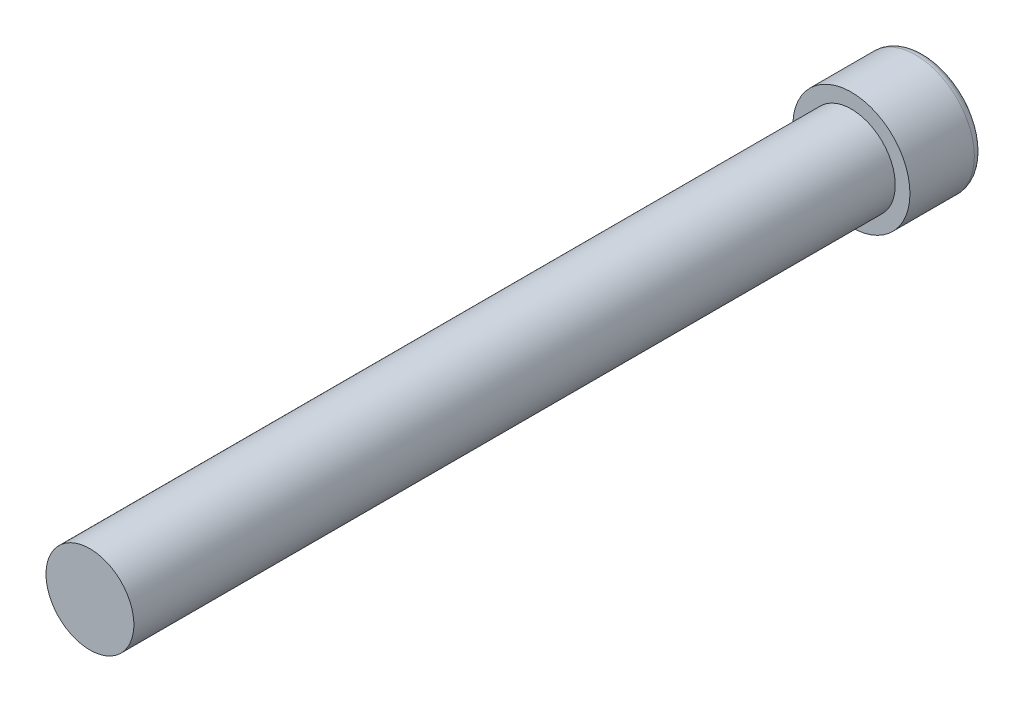
ISO-10303-21;
HEADER;
FILE_DESCRIPTION(('STEP AP214'),'2;1');
FILE_NAME('part.step','',(''),(''),'','','');
FILE_SCHEMA(('AUTOMOTIVE_DESIGN { 1 0 10303 214 1 1 1 1 }'));
ENDSEC;
DATA;
#1=APPLICATION_CONTEXT('core data for automotive mechanical design processes');
#2=APPLICATION_PROTOCOL_DEFINITION('international standard','automotive_design',2000,#1);
#3=PRODUCT_CONTEXT('',#1,'mechanical');
#4=PRODUCT('Part','Part','',(#3));
#5=PRODUCT_RELATED_PRODUCT_CATEGORY('part','',(#4));
#6=PRODUCT_DEFINITION_FORMATION('','',#4);
#7=PRODUCT_DEFINITION_CONTEXT('part definition',#1,'design');
#8=PRODUCT_DEFINITION('design','',#6,#7);
#9=PRODUCT_DEFINITION_SHAPE('','',#8);
#10=(LENGTH_UNIT() NAMED_UNIT(*) SI_UNIT(.MILLI.,.METRE.));
#11=(NAMED_UNIT(*) PLANE_ANGLE_UNIT() SI_UNIT($,.RADIAN.));
#12=(NAMED_UNIT(*) SI_UNIT($,.STERADIAN.) SOLID_ANGLE_UNIT());
#13=UNCERTAINTY_MEASURE_WITH_UNIT(LENGTH_MEASURE(1.E-05),#10,'distance_accuracy_value','');
#14=(GEOMETRIC_REPRESENTATION_CONTEXT(3) GLOBAL_UNCERTAINTY_ASSIGNED_CONTEXT((#13)) GLOBAL_UNIT_ASSIGNED_CONTEXT((#10,
#11,#12)) REPRESENTATION_CONTEXT('',''));
#15=CARTESIAN_POINT('',(0.,0.,0.));
#16=DIRECTION('',(0.,0.,1.));
#17=DIRECTION('',(1.,0.,0.));
#18=AXIS2_PLACEMENT_3D('',#15,#16,#17);
#19=CARTESIAN_POINT('',(0.,0.,2.5));
#20=DIRECTION('',(0.,0.,1.));
#21=DIRECTION('',(1.,0.,0.));
#22=AXIS2_PLACEMENT_3D('',#19,#20,#21);
#23=PLANE('',#22);
#24=CARTESIAN_POINT('',(0.,0.,2.5));
#25=DIRECTION('',(0.,0.,1.));
#26=DIRECTION('',(1.,0.,0.));
#27=AXIS2_PLACEMENT_3D('',#24,#25,#26);
#28=CIRCLE('',#27,2.);
#29=CARTESIAN_POINT('',(2.,0.,2.5));
#30=VERTEX_POINT('',#29);
#31=EDGE_CURVE('E141',#30,#30,#28,.T.);
#32=ORIENTED_EDGE('',*,*,#31,.T.);
#33=EDGE_LOOP('',(#32));
#34=FACE_BOUND('',#33,.T.);
#35=CARTESIAN_POINT('',(0.,0.,2.5));
#36=DIRECTION('',(0.,0.,1.));
#37=DIRECTION('',(1.,0.,0.));
#38=AXIS2_PLACEMENT_3D('',#35,#36,#37);
#39=CIRCLE('',#38,1.5);
#40=CARTESIAN_POINT('',(-1.5,0.,2.5));
#41=VERTEX_POINT('',#40);
#42=EDGE_CURVE('E132',#41,#41,#39,.T.);
#43=ORIENTED_EDGE('',*,*,#42,.F.);
#44=EDGE_LOOP('',(#43));
#45=FACE_BOUND('',#44,.T.);
#46=ADVANCED_FACE('F30',(#34,#45),#23,.T.);
#47=CARTESIAN_POINT('',(0.,0.,2.5));
#48=DIRECTION('',(0.,0.,-1.));
#49=DIRECTION('',(-1.,0.,0.));
#50=AXIS2_PLACEMENT_3D('',#47,#48,#49);
#51=CYLINDRICAL_SURFACE('',#50,2.);
#52=CARTESIAN_POINT('',(0.,0.,0.3));
#53=DIRECTION('',(0.,0.,1.));
#54=DIRECTION('',(1.,0.,0.));
#55=AXIS2_PLACEMENT_3D('',#52,#53,#54);
#56=CIRCLE('',#55,2.);
#57=CARTESIAN_POINT('',(2.,0.,0.3));
#58=VERTEX_POINT('',#57);
#59=EDGE_CURVE('E38',#58,#58,#56,.T.);
#60=ORIENTED_EDGE('',*,*,#59,.T.);
#61=EDGE_LOOP('',(#60));
#62=FACE_BOUND('',#61,.T.);
#63=ORIENTED_EDGE('',*,*,#31,.F.);
#64=EDGE_LOOP('',(#63));
#65=FACE_BOUND('',#64,.T.);
#66=ADVANCED_FACE('F148',(#62,#65),#51,.T.);
#67=CARTESIAN_POINT('',(0.,0.,0.));
#68=DIRECTION('',(0.,0.,1.));
#69=DIRECTION('',(1.,0.,0.));
#70=AXIS2_PLACEMENT_3D('',#67,#68,#69);
#71=PLANE('',#70);
#72=DIRECTION('',(0.5,0.866025403784439,0.));
#73=VECTOR('',#72,1.);
#74=CARTESIAN_POINT('',(-1.5357517160444,0.,0.));
#75=LINE('',#74,#73);
#76=CARTESIAN_POINT('',(-1.5357517160444,0.,0.));
#77=VERTEX_POINT('',#76);
#78=CARTESIAN_POINT('',(-0.767875858022201,1.33,0.));
#79=VERTEX_POINT('',#78);
#80=EDGE_CURVE('E119',#77,#79,#75,.T.);
#81=ORIENTED_EDGE('',*,*,#80,.F.);
#82=DIRECTION('',(-0.5,0.866025403784439,0.));
#83=VECTOR('',#82,1.);
#84=CARTESIAN_POINT('',(-0.767875858022202,-1.33,0.));
#85=LINE('',#84,#83);
#86=CARTESIAN_POINT('',(-0.767875858022202,-1.33,0.));
#87=VERTEX_POINT('',#86);
#88=EDGE_CURVE('E45',#87,#77,#85,.T.);
#89=ORIENTED_EDGE('',*,*,#88,.F.);
#90=DIRECTION('',(-1.,0.,0.));
#91=VECTOR('',#90,1.);
#92=CARTESIAN_POINT('',(0.767875858022202,-1.33,0.));
#93=LINE('',#92,#91);
#94=CARTESIAN_POINT('',(0.767875858022202,-1.33,0.));
#95=VERTEX_POINT('',#94);
#96=EDGE_CURVE('E128',#95,#87,#93,.T.);
#97=ORIENTED_EDGE('',*,*,#96,.F.);
#98=DIRECTION('',(-0.5,-0.866025403784438,0.));
#99=VECTOR('',#98,1.);
#100=CARTESIAN_POINT('',(1.5357517160444,0.,0.));
#101=LINE('',#100,#99);
#102=CARTESIAN_POINT('',(1.5357517160444,0.,0.));
#103=VERTEX_POINT('',#102);
#104=EDGE_CURVE('E126',#103,#95,#101,.T.);
#105=ORIENTED_EDGE('',*,*,#104,.F.);
#106=DIRECTION('',(0.5,-0.866025403784439,0.));
#107=VECTOR('',#106,1.);
#108=CARTESIAN_POINT('',(0.767875858022202,1.33,0.));
#109=LINE('',#108,#107);
#110=CARTESIAN_POINT('',(0.767875858022202,1.33,0.));
#111=VERTEX_POINT('',#110);
#112=EDGE_CURVE('E93',#111,#103,#109,.T.);
#113=ORIENTED_EDGE('',*,*,#112,.F.);
#114=DIRECTION('',(1.,0.,0.));
#115=VECTOR('',#114,1.);
#116=CARTESIAN_POINT('',(-0.767875858022201,1.33,0.));
#117=LINE('',#116,#115);
#118=EDGE_CURVE('E122',#79,#111,#117,.T.);
#119=ORIENTED_EDGE('',*,*,#118,.F.);
#120=EDGE_LOOP('',(#81,#89,#97,#105,#113,#119));
#121=FACE_BOUND('',#120,.T.);
#122=CARTESIAN_POINT('',(0.,0.,0.));
#123=DIRECTION('',(0.,0.,1.));
#124=DIRECTION('',(1.,0.,0.));
#125=AXIS2_PLACEMENT_3D('',#122,#123,#124);
#126=CIRCLE('',#125,1.7);
#127=CARTESIAN_POINT('',(1.7,0.,0.));
#128=VERTEX_POINT('',#127);
#129=EDGE_CURVE('E11',#128,#128,#126,.F.);
#130=ORIENTED_EDGE('',*,*,#129,.T.);
#131=EDGE_LOOP('',(#130));
#132=FACE_BOUND('',#131,.T.);
#133=ADVANCED_FACE('F171',(#121,#132),#71,.F.);
#134=CARTESIAN_POINT('',(0.,0.,28.5));
#135=DIRECTION('',(0.,0.,-1.));
#136=DIRECTION('',(-1.,0.,0.));
#137=AXIS2_PLACEMENT_3D('',#134,#135,#136);
#138=CYLINDRICAL_SURFACE('',#137,1.5);
#139=CARTESIAN_POINT('',(0.,0.,28.5));
#140=DIRECTION('',(0.,0.,1.));
#141=DIRECTION('',(1.,0.,0.));
#142=AXIS2_PLACEMENT_3D('',#139,#140,#141);
#143=CIRCLE('',#142,1.5);
#144=CARTESIAN_POINT('',(-1.5,0.,28.5));
#145=VERTEX_POINT('',#144);
#146=EDGE_CURVE('E138',#145,#145,#143,.T.);
#147=CARTESIAN_POINT('',(-1.5,0.,28.5));
#148=CARTESIAN_POINT('',(-1.5,0.,28.2291666666667));
#149=CARTESIAN_POINT('',(-1.5,0.,27.9583333333333));
#150=CARTESIAN_POINT('',(-1.5,0.,27.4166666666667));
#151=CARTESIAN_POINT('',(-1.5,0.,27.1458333333333));
#152=CARTESIAN_POINT('',(-1.5,0.,26.6041666666667));
#153=CARTESIAN_POINT('',(-1.5,0.,26.3333333333333));
#154=CARTESIAN_POINT('',(-1.5,0.,25.7916666666667));
#155=CARTESIAN_POINT('',(-1.5,0.,25.5208333333333));
#156=CARTESIAN_POINT('',(-1.5,0.,24.9791666666667));
#157=CARTESIAN_POINT('',(-1.5,0.,24.7083333333333));
#158=CARTESIAN_POINT('',(-1.5,0.,24.1666666666667));
#159=CARTESIAN_POINT('',(-1.5,0.,23.8958333333333));
#160=CARTESIAN_POINT('',(-1.5,0.,23.3541666666667));
#161=CARTESIAN_POINT('',(-1.5,0.,23.0833333333333));
#162=CARTESIAN_POINT('',(-1.5,0.,22.5416666666667));
#163=CARTESIAN_POINT('',(-1.5,0.,22.2708333333333));
#164=CARTESIAN_POINT('',(-1.5,0.,21.7291666666667));
#165=CARTESIAN_POINT('',(-1.5,0.,21.4583333333333));
#166=CARTESIAN_POINT('',(-1.5,0.,20.9166666666667));
#167=CARTESIAN_POINT('',(-1.5,0.,20.6458333333333));
#168=CARTESIAN_POINT('',(-1.5,0.,20.1041666666667));
#169=CARTESIAN_POINT('',(-1.5,0.,19.8333333333333));
#170=CARTESIAN_POINT('',(-1.5,0.,19.2916666666667));
#171=CARTESIAN_POINT('',(-1.5,0.,19.0208333333333));
#172=CARTESIAN_POINT('',(-1.5,0.,18.4791666666667));
#173=CARTESIAN_POINT('',(-1.5,0.,18.2083333333333));
#174=CARTESIAN_POINT('',(-1.5,0.,17.6666666666667));
#175=CARTESIAN_POINT('',(-1.5,0.,17.3958333333333));
#176=CARTESIAN_POINT('',(-1.5,0.,16.8541666666667));
#177=CARTESIAN_POINT('',(-1.5,0.,16.5833333333333));
#178=CARTESIAN_POINT('',(-1.5,0.,16.0416666666667));
#179=CARTESIAN_POINT('',(-1.5,0.,15.7708333333333));
#180=CARTESIAN_POINT('',(-1.5,0.,15.2291666666667));
#181=CARTESIAN_POINT('',(-1.5,0.,14.9583333333333));
#182=CARTESIAN_POINT('',(-1.5,0.,14.4166666666667));
#183=CARTESIAN_POINT('',(-1.5,0.,14.1458333333333));
#184=CARTESIAN_POINT('',(-1.5,0.,13.6041666666667));
#185=CARTESIAN_POINT('',(-1.5,0.,13.3333333333333));
#186=CARTESIAN_POINT('',(-1.5,0.,12.7916666666667));
#187=CARTESIAN_POINT('',(-1.5,0.,12.5208333333333));
#188=CARTESIAN_POINT('',(-1.5,0.,11.9791666666667));
#189=CARTESIAN_POINT('',(-1.5,0.,11.7083333333333));
#190=CARTESIAN_POINT('',(-1.5,0.,11.1666666666667));
#191=CARTESIAN_POINT('',(-1.5,0.,10.8958333333333));
#192=CARTESIAN_POINT('',(-1.5,0.,10.3541666666667));
#193=CARTESIAN_POINT('',(-1.5,0.,10.0833333333333));
#194=CARTESIAN_POINT('',(-1.5,0.,9.54166666666667));
#195=CARTESIAN_POINT('',(-1.5,0.,9.27083333333333));
#196=CARTESIAN_POINT('',(-1.5,0.,8.72916666666666));
#197=CARTESIAN_POINT('',(-1.5,0.,8.45833333333333));
#198=CARTESIAN_POINT('',(-1.5,0.,7.91666666666667));
#199=CARTESIAN_POINT('',(-1.5,0.,7.64583333333333));
#200=CARTESIAN_POINT('',(-1.5,0.,7.10416666666667));
#201=CARTESIAN_POINT('',(-1.5,0.,6.83333333333333));
#202=CARTESIAN_POINT('',(-1.5,0.,6.29166666666667));
#203=CARTESIAN_POINT('',(-1.5,0.,6.02083333333333));
#204=CARTESIAN_POINT('',(-1.5,0.,5.47916666666666));
#205=CARTESIAN_POINT('',(-1.5,0.,5.20833333333333));
#206=CARTESIAN_POINT('',(-1.5,0.,4.66666666666667));
#207=CARTESIAN_POINT('',(-1.5,0.,4.39583333333333));
#208=CARTESIAN_POINT('',(-1.5,0.,3.85416666666667));
#209=CARTESIAN_POINT('',(-1.5,0.,3.58333333333333));
#210=CARTESIAN_POINT('',(-1.5,0.,3.04166666666667));
#211=CARTESIAN_POINT('',(-1.5,0.,2.77083333333333));
#212=CARTESIAN_POINT('',(-1.5,0.,2.5));
#213=B_SPLINE_CURVE_WITH_KNOTS('',3,(#147,#148,#149,#150,#151,#152,#153,#154,#155,#156,#157,
#158,#159,#160,#161,#162,#163,#164,#165,#166,#167,#168,#169,#170,#171,#172,#173,#174,#175,#176,
#177,#178,#179,#180,#181,#182,#183,#184,#185,#186,#187,#188,#189,#190,#191,#192,#193,#194,#195,
#196,#197,#198,#199,#200,#201,#202,#203,#204,#205,#206,#207,#208,#209,#210,#211,#212),
.UNSPECIFIED.,.F.,.F.,(4,2,2,2,2,2,2,2,2,2,2,2,2,2,2,2,2,2,2,2,2,2,2,2,2,2,2,2,2,2,2,2,4),(0.,
0.812500000000001,1.625,2.4375,3.25,4.0625,4.875,5.6875,6.5,7.3125,8.125,8.9375,9.75,10.5625,
11.375,12.1875,13.,13.8125,14.625,15.4375,16.25,17.0625,17.875,18.6875,19.5,20.3125,21.125,
21.9375,22.75,23.5625,24.375,25.1875,26.),.UNSPECIFIED.);
#214=EDGE_CURVE('BSEAM161',#145,#41,#213,.T.);
#215=ORIENTED_EDGE('',*,*,#146,.F.);
#216=ORIENTED_EDGE('',*,*,#42,.T.);
#217=ORIENTED_EDGE('',*,*,#214,.T.);
#218=ORIENTED_EDGE('',*,*,#214,.F.);
#219=EDGE_LOOP('',(#215,#217,#216,#218));
#220=FACE_BOUND('',#219,.T.);
#221=ADVANCED_FACE('F161',(#220),#138,.T.);
#222=CARTESIAN_POINT('',(0.,0.,28.5));
#223=DIRECTION('',(0.,0.,1.));
#224=DIRECTION('',(1.,0.,0.));
#225=AXIS2_PLACEMENT_3D('',#222,#223,#224);
#226=PLANE('',#225);
#227=ORIENTED_EDGE('',*,*,#146,.T.);
#228=EDGE_LOOP('',(#227));
#229=FACE_BOUND('',#228,.T.);
#230=ADVANCED_FACE('F153',(#229),#226,.T.);
#231=CARTESIAN_POINT('',(0.,0.,0.3));
#232=DIRECTION('',(0.,0.,1.));
#233=DIRECTION('',(1.,0.,0.));
#234=AXIS2_PLACEMENT_3D('',#231,#232,#233);
#235=TOROIDAL_SURFACE('',#234,1.7,0.3);
#236=ORIENTED_EDGE('',*,*,#129,.F.);
#237=EDGE_LOOP('',(#236));
#238=FACE_BOUND('',#237,.T.);
#239=ORIENTED_EDGE('',*,*,#59,.F.);
#240=EDGE_LOOP('',(#239));
#241=FACE_BOUND('',#240,.T.);
#242=ADVANCED_FACE('F32',(#238,#241),#235,.T.);
#243=CARTESIAN_POINT('',(-0.767875858022202,-1.33,2.));
#244=DIRECTION('',(-0.866025403784439,-0.5,0.));
#245=DIRECTION('',(0.5,-0.866025403784439,0.));
#246=AXIS2_PLACEMENT_3D('',#243,#244,#245);
#247=PLANE('',#246);
#248=ORIENTED_EDGE('',*,*,#88,.T.);
#249=DIRECTION('',(0.,0.,-1.));
#250=VECTOR('',#249,1.);
#251=CARTESIAN_POINT('',(-1.5357517160444,0.,2.));
#252=LINE('',#251,#250);
#253=CARTESIAN_POINT('',(-1.5357517160444,0.,2.));
#254=VERTEX_POINT('',#253);
#255=EDGE_CURVE('E75',#254,#77,#252,.T.);
#256=ORIENTED_EDGE('',*,*,#255,.F.);
#257=DIRECTION('',(-0.5,0.866025403784439,0.));
#258=VECTOR('',#257,1.);
#259=CARTESIAN_POINT('',(-0.767875858022202,-1.33,2.));
#260=LINE('',#259,#258);
#261=CARTESIAN_POINT('',(-0.767875858022202,-1.33,2.));
#262=VERTEX_POINT('',#261);
#263=EDGE_CURVE('E130',#262,#254,#260,.T.);
#264=ORIENTED_EDGE('',*,*,#263,.F.);
#265=DIRECTION('',(0.,0.,-1.));
#266=VECTOR('',#265,1.);
#267=CARTESIAN_POINT('',(-0.767875858022202,-1.33,2.));
#268=LINE('',#267,#266);
#269=EDGE_CURVE('E53',#262,#87,#268,.T.);
#270=ORIENTED_EDGE('',*,*,#269,.T.);
#271=EDGE_LOOP('',(#248,#256,#264,#270));
#272=FACE_BOUND('',#271,.T.);
#273=ADVANCED_FACE('F152',(#272),#247,.F.);
#274=CARTESIAN_POINT('',(0.767875858022202,-1.33,2.));
#275=DIRECTION('',(0.,-1.,0.));
#276=DIRECTION('',(1.,0.,0.));
#277=AXIS2_PLACEMENT_3D('',#274,#275,#276);
#278=PLANE('',#277);
#279=ORIENTED_EDGE('',*,*,#96,.T.);
#280=ORIENTED_EDGE('',*,*,#269,.F.);
#281=DIRECTION('',(-1.,0.,0.));
#282=VECTOR('',#281,1.);
#283=CARTESIAN_POINT('',(0.767875858022202,-1.33,2.));
#284=LINE('',#283,#282);
#285=CARTESIAN_POINT('',(0.767875858022202,-1.33,2.));
#286=VERTEX_POINT('',#285);
#287=EDGE_CURVE('E105',#286,#262,#284,.T.);
#288=ORIENTED_EDGE('',*,*,#287,.F.);
#289=DIRECTION('',(0.,0.,-1.));
#290=VECTOR('',#289,1.);
#291=CARTESIAN_POINT('',(0.767875858022202,-1.33,2.));
#292=LINE('',#291,#290);
#293=EDGE_CURVE('E97',#286,#95,#292,.T.);
#294=ORIENTED_EDGE('',*,*,#293,.T.);
#295=EDGE_LOOP('',(#279,#280,#288,#294));
#296=FACE_BOUND('',#295,.T.);
#297=ADVANCED_FACE('F159',(#296),#278,.F.);
#298=CARTESIAN_POINT('',(1.5357517160444,0.,2.));
#299=DIRECTION('',(0.866025403784438,-0.5,0.));
#300=DIRECTION('',(0.5,0.866025403784439,0.));
#301=AXIS2_PLACEMENT_3D('',#298,#299,#300);
#302=PLANE('',#301);
#303=ORIENTED_EDGE('',*,*,#104,.T.);
#304=ORIENTED_EDGE('',*,*,#293,.F.);
#305=DIRECTION('',(-0.5,-0.866025403784438,0.));
#306=VECTOR('',#305,1.);
#307=CARTESIAN_POINT('',(1.5357517160444,0.,2.));
#308=LINE('',#307,#306);
#309=CARTESIAN_POINT('',(1.5357517160444,0.,2.));
#310=VERTEX_POINT('',#309);
#311=EDGE_CURVE('E101',#310,#286,#308,.T.);
#312=ORIENTED_EDGE('',*,*,#311,.F.);
#313=DIRECTION('',(0.,0.,-1.));
#314=VECTOR('',#313,1.);
#315=CARTESIAN_POINT('',(1.5357517160444,0.,2.));
#316=LINE('',#315,#314);
#317=EDGE_CURVE('E86',#310,#103,#316,.T.);
#318=ORIENTED_EDGE('',*,*,#317,.T.);
#319=EDGE_LOOP('',(#303,#304,#312,#318));
#320=FACE_BOUND('',#319,.T.);
#321=ADVANCED_FACE('F102',(#320),#302,.F.);
#322=CARTESIAN_POINT('',(0.767875858022202,1.33,2.));
#323=DIRECTION('',(0.866025403784439,0.5,0.));
#324=DIRECTION('',(-0.5,0.866025403784439,0.));
#325=AXIS2_PLACEMENT_3D('',#322,#323,#324);
#326=PLANE('',#325);
#327=ORIENTED_EDGE('',*,*,#112,.T.);
#328=ORIENTED_EDGE('',*,*,#317,.F.);
#329=DIRECTION('',(0.5,-0.866025403784439,0.));
#330=VECTOR('',#329,1.);
#331=CARTESIAN_POINT('',(0.767875858022202,1.33,2.));
#332=LINE('',#331,#330);
#333=CARTESIAN_POINT('',(0.767875858022202,1.33,2.));
#334=VERTEX_POINT('',#333);
#335=EDGE_CURVE('E90',#334,#310,#332,.T.);
#336=ORIENTED_EDGE('',*,*,#335,.F.);
#337=DIRECTION('',(0.,0.,-1.));
#338=VECTOR('',#337,1.);
#339=CARTESIAN_POINT('',(0.767875858022202,1.33,2.));
#340=LINE('',#339,#338);
#341=EDGE_CURVE('E98',#334,#111,#340,.T.);
#342=ORIENTED_EDGE('',*,*,#341,.T.);
#343=EDGE_LOOP('',(#327,#328,#336,#342));
#344=FACE_BOUND('',#343,.T.);
#345=ADVANCED_FACE('F88',(#344),#326,.F.);
#346=CARTESIAN_POINT('',(-0.767875858022201,1.33,2.));
#347=DIRECTION('',(0.,1.,0.));
#348=DIRECTION('',(-1.,0.,0.));
#349=AXIS2_PLACEMENT_3D('',#346,#347,#348);
#350=PLANE('',#349);
#351=ORIENTED_EDGE('',*,*,#118,.T.);
#352=ORIENTED_EDGE('',*,*,#341,.F.);
#353=DIRECTION('',(1.,0.,0.));
#354=VECTOR('',#353,1.);
#355=CARTESIAN_POINT('',(-0.767875858022201,1.33,2.));
#356=LINE('',#355,#354);
#357=CARTESIAN_POINT('',(-0.767875858022201,1.33,2.));
#358=VERTEX_POINT('',#357);
#359=EDGE_CURVE('E111',#358,#334,#356,.T.);
#360=ORIENTED_EDGE('',*,*,#359,.F.);
#361=DIRECTION('',(0.,0.,-1.));
#362=VECTOR('',#361,1.);
#363=CARTESIAN_POINT('',(-0.767875858022201,1.33,2.));
#364=LINE('',#363,#362);
#365=EDGE_CURVE('E135',#358,#79,#364,.T.);
#366=ORIENTED_EDGE('',*,*,#365,.T.);
#367=EDGE_LOOP('',(#351,#352,#360,#366));
#368=FACE_BOUND('',#367,.T.);
#369=ADVANCED_FACE('F198',(#368),#350,.F.);
#370=CARTESIAN_POINT('',(-1.5357517160444,0.,2.));
#371=DIRECTION('',(-0.866025403784439,0.5,0.));
#372=DIRECTION('',(-0.5,-0.866025403784439,0.));
#373=AXIS2_PLACEMENT_3D('',#370,#371,#372);
#374=PLANE('',#373);
#375=ORIENTED_EDGE('',*,*,#80,.T.);
#376=ORIENTED_EDGE('',*,*,#365,.F.);
#377=DIRECTION('',(0.5,0.866025403784439,0.));
#378=VECTOR('',#377,1.);
#379=CARTESIAN_POINT('',(-1.5357517160444,0.,2.));
#380=LINE('',#379,#378);
#381=EDGE_CURVE('E113',#254,#358,#380,.T.);
#382=ORIENTED_EDGE('',*,*,#381,.F.);
#383=ORIENTED_EDGE('',*,*,#255,.T.);
#384=EDGE_LOOP('',(#375,#376,#382,#383));
#385=FACE_BOUND('',#384,.T.);
#386=ADVANCED_FACE('F186',(#385),#374,.F.);
#387=CARTESIAN_POINT('',(-0.767875858022202,-1.33,2.));
#388=DIRECTION('',(0.,0.,1.));
#389=DIRECTION('',(1.,0.,0.));
#390=AXIS2_PLACEMENT_3D('',#387,#388,#389);
#391=PLANE('',#390);
#392=ORIENTED_EDGE('',*,*,#263,.T.);
#393=ORIENTED_EDGE('',*,*,#381,.T.);
#394=ORIENTED_EDGE('',*,*,#359,.T.);
#395=ORIENTED_EDGE('',*,*,#335,.T.);
#396=ORIENTED_EDGE('',*,*,#311,.T.);
#397=ORIENTED_EDGE('',*,*,#287,.T.);
#398=EDGE_LOOP('',(#392,#393,#394,#395,#396,#397));
#399=FACE_BOUND('',#398,.T.);
#400=ADVANCED_FACE('F108',(#399),#391,.F.);
#401=CLOSED_SHELL('',(#46,#66,#133,#221,#230,#242,#273,#297,#321,#345,#369,#386,#400));
#402=MANIFOLD_SOLID_BREP('B2',#401);
#403=ADVANCED_BREP_SHAPE_REPRESENTATION('',(#18,#402),#14);
#404=SHAPE_DEFINITION_REPRESENTATION(#9,#403);
ENDSEC;
END-ISO-10303-21;
